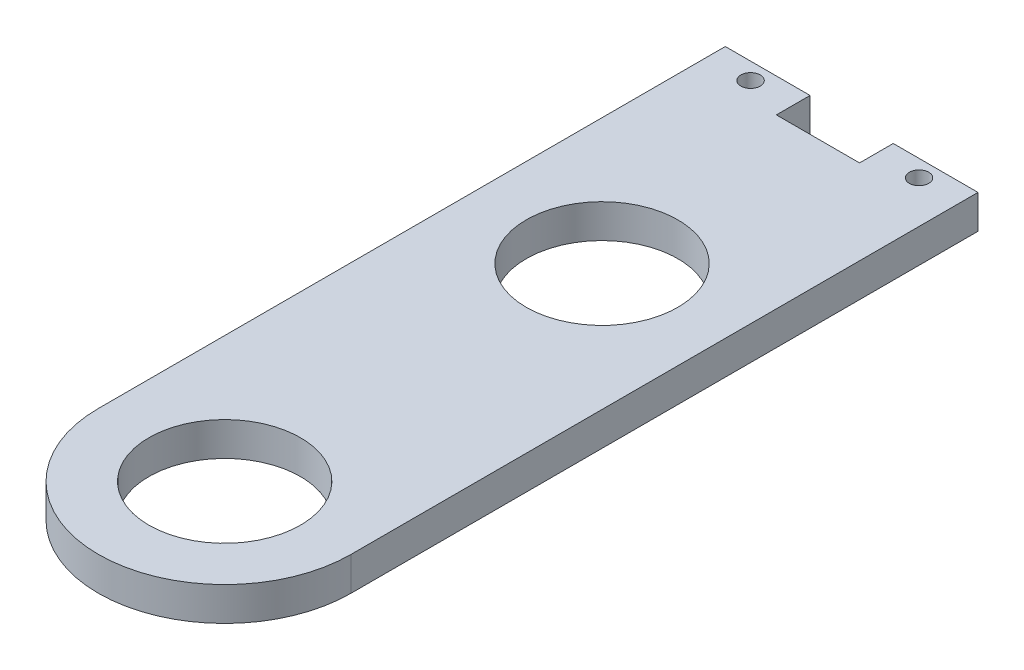
ISO-10303-21;
HEADER;
FILE_DESCRIPTION(('STEP AP214'),'2;1');
FILE_NAME('part.step','',(''),(''),'','','');
FILE_SCHEMA(('AUTOMOTIVE_DESIGN { 1 0 10303 214 1 1 1 1 }'));
ENDSEC;
DATA;
#1=APPLICATION_CONTEXT('core data for automotive mechanical design processes');
#2=APPLICATION_PROTOCOL_DEFINITION('international standard','automotive_design',2000,#1);
#3=PRODUCT_CONTEXT('',#1,'mechanical');
#4=PRODUCT('Part','Part','',(#3));
#5=PRODUCT_RELATED_PRODUCT_CATEGORY('part','',(#4));
#6=PRODUCT_DEFINITION_FORMATION('','',#4);
#7=PRODUCT_DEFINITION_CONTEXT('part definition',#1,'design');
#8=PRODUCT_DEFINITION('design','',#6,#7);
#9=PRODUCT_DEFINITION_SHAPE('','',#8);
#10=(LENGTH_UNIT() NAMED_UNIT(*) SI_UNIT(.MILLI.,.METRE.));
#11=(NAMED_UNIT(*) PLANE_ANGLE_UNIT() SI_UNIT($,.RADIAN.));
#12=(NAMED_UNIT(*) SI_UNIT($,.STERADIAN.) SOLID_ANGLE_UNIT());
#13=UNCERTAINTY_MEASURE_WITH_UNIT(LENGTH_MEASURE(1.E-05),#10,'distance_accuracy_value','');
#14=(GEOMETRIC_REPRESENTATION_CONTEXT(3) GLOBAL_UNCERTAINTY_ASSIGNED_CONTEXT((#13)) GLOBAL_UNIT_ASSIGNED_CONTEXT((#10,
#11,#12)) REPRESENTATION_CONTEXT('',''));
#15=CARTESIAN_POINT('',(0.,0.,0.));
#16=DIRECTION('',(0.,0.,1.));
#17=DIRECTION('',(1.,0.,0.));
#18=AXIS2_PLACEMENT_3D('',#15,#16,#17);
#19=CARTESIAN_POINT('',(0.,6.35,-76.2));
#20=DIRECTION('',(0.,0.,-1.));
#21=DIRECTION('',(-1.,0.,0.));
#22=AXIS2_PLACEMENT_3D('',#19,#20,#21);
#23=PLANE('',#22);
#24=DIRECTION('',(1.,0.,0.));
#25=VECTOR('',#24,1.);
#26=CARTESIAN_POINT('',(0.,6.35,-76.2));
#27=LINE('',#26,#25);
#28=CARTESIAN_POINT('',(-7.83750000000001,6.35,-76.2));
#29=VERTEX_POINT('',#28);
#30=CARTESIAN_POINT('',(7.83749999999999,6.35,-76.2));
#31=VERTEX_POINT('',#30);
#32=EDGE_CURVE('E173',#29,#31,#27,.T.);
#33=ORIENTED_EDGE('',*,*,#32,.T.);
#34=DIRECTION('',(0.,1.,0.));
#35=VECTOR('',#34,1.);
#36=CARTESIAN_POINT('',(7.83749999999999,0.,-76.2));
#37=LINE('',#36,#35);
#38=CARTESIAN_POINT('',(7.83749999999999,0.,-76.2));
#39=VERTEX_POINT('',#38);
#40=EDGE_CURVE('E131',#39,#31,#37,.T.);
#41=ORIENTED_EDGE('',*,*,#40,.F.);
#42=DIRECTION('',(1.,0.,0.));
#43=VECTOR('',#42,1.);
#44=CARTESIAN_POINT('',(0.,0.,-76.2));
#45=LINE('',#44,#43);
#46=CARTESIAN_POINT('',(-7.83750000000001,0.,-76.2));
#47=VERTEX_POINT('',#46);
#48=EDGE_CURVE('E113',#47,#39,#45,.T.);
#49=ORIENTED_EDGE('',*,*,#48,.F.);
#50=DIRECTION('',(0.,1.,0.));
#51=VECTOR('',#50,1.);
#52=CARTESIAN_POINT('',(-7.83750000000001,0.,-76.2));
#53=LINE('',#52,#51);
#54=EDGE_CURVE('E147',#47,#29,#53,.T.);
#55=ORIENTED_EDGE('',*,*,#54,.T.);
#56=EDGE_LOOP('',(#33,#41,#49,#55));
#57=FACE_BOUND('',#56,.T.);
#58=ADVANCED_FACE('F36',(#57),#23,.T.);
#59=CARTESIAN_POINT('',(23.8125,6.35,0.));
#60=DIRECTION('',(-1.,0.,0.));
#61=DIRECTION('',(0.,0.,1.));
#62=AXIS2_PLACEMENT_3D('',#59,#60,#61);
#63=PLANE('',#62);
#64=DIRECTION('',(0.,1.,0.));
#65=VECTOR('',#64,1.);
#66=CARTESIAN_POINT('',(23.8125,0.,35.6108));
#67=LINE('',#66,#65);
#68=CARTESIAN_POINT('',(23.8125,0.,35.6108));
#69=VERTEX_POINT('',#68);
#70=CARTESIAN_POINT('',(23.8125,6.35,35.6108));
#71=VERTEX_POINT('',#70);
#72=EDGE_CURVE('E111',#69,#71,#67,.T.);
#73=ORIENTED_EDGE('',*,*,#72,.F.);
#74=DIRECTION('',(0.,0.,-1.));
#75=VECTOR('',#74,1.);
#76=CARTESIAN_POINT('',(23.8125,0.,0.));
#77=LINE('',#76,#75);
#78=CARTESIAN_POINT('',(23.8125,0.,-82.55));
#79=VERTEX_POINT('',#78);
#80=EDGE_CURVE('E106',#69,#79,#77,.T.);
#81=ORIENTED_EDGE('',*,*,#80,.T.);
#82=DIRECTION('',(0.,1.,0.));
#83=VECTOR('',#82,1.);
#84=CARTESIAN_POINT('',(23.8125,0.,-82.55));
#85=LINE('',#84,#83);
#86=CARTESIAN_POINT('',(23.8125,6.35,-82.55));
#87=VERTEX_POINT('',#86);
#88=EDGE_CURVE('E110',#79,#87,#85,.T.);
#89=ORIENTED_EDGE('',*,*,#88,.T.);
#90=DIRECTION('',(0.,0.,-1.));
#91=VECTOR('',#90,1.);
#92=CARTESIAN_POINT('',(23.8125,6.35,0.));
#93=LINE('',#92,#91);
#94=EDGE_CURVE('E178',#71,#87,#93,.T.);
#95=ORIENTED_EDGE('',*,*,#94,.F.);
#96=EDGE_LOOP('',(#73,#81,#89,#95));
#97=FACE_BOUND('',#96,.T.);
#98=ADVANCED_FACE('F38',(#97),#63,.F.);
#99=CARTESIAN_POINT('',(-23.8125,6.35,0.));
#100=DIRECTION('',(-1.,0.,0.));
#101=DIRECTION('',(0.,0.,1.));
#102=AXIS2_PLACEMENT_3D('',#99,#100,#101);
#103=PLANE('',#102);
#104=DIRECTION('',(0.,0.,-1.));
#105=VECTOR('',#104,1.);
#106=CARTESIAN_POINT('',(-23.8125,0.,0.));
#107=LINE('',#106,#105);
#108=CARTESIAN_POINT('',(-23.8125,0.,35.6108));
#109=VERTEX_POINT('',#108);
#110=CARTESIAN_POINT('',(-23.8125,0.,-82.55));
#111=VERTEX_POINT('',#110);
#112=EDGE_CURVE('E189',#109,#111,#107,.T.);
#113=ORIENTED_EDGE('',*,*,#112,.F.);
#114=DIRECTION('',(0.,1.,0.));
#115=VECTOR('',#114,1.);
#116=CARTESIAN_POINT('',(-23.8125,0.,35.6108));
#117=LINE('',#116,#115);
#118=CARTESIAN_POINT('',(-23.8125,6.35,35.6108));
#119=VERTEX_POINT('',#118);
#120=EDGE_CURVE('E61',#109,#119,#117,.T.);
#121=ORIENTED_EDGE('',*,*,#120,.T.);
#122=DIRECTION('',(0.,0.,-1.));
#123=VECTOR('',#122,1.);
#124=CARTESIAN_POINT('',(-23.8125,6.35,0.));
#125=LINE('',#124,#123);
#126=CARTESIAN_POINT('',(-23.8125,6.35,-82.55));
#127=VERTEX_POINT('',#126);
#128=EDGE_CURVE('E177',#119,#127,#125,.T.);
#129=ORIENTED_EDGE('',*,*,#128,.T.);
#130=DIRECTION('',(0.,1.,0.));
#131=VECTOR('',#130,1.);
#132=CARTESIAN_POINT('',(-23.8125,0.,-82.55));
#133=LINE('',#132,#131);
#134=EDGE_CURVE('E144',#111,#127,#133,.T.);
#135=ORIENTED_EDGE('',*,*,#134,.F.);
#136=EDGE_LOOP('',(#113,#121,#129,#135));
#137=FACE_BOUND('',#136,.T.);
#138=ADVANCED_FACE('F208',(#137),#103,.T.);
#139=CARTESIAN_POINT('',(0.,6.35,0.));
#140=DIRECTION('',(0.,1.,0.));
#141=DIRECTION('',(0.,0.,1.));
#142=AXIS2_PLACEMENT_3D('',#139,#140,#141);
#143=PLANE('',#142);
#144=CARTESIAN_POINT('',(15.875,6.35,-79.375));
#145=DIRECTION('',(0.,1.,0.));
#146=DIRECTION('',(0.,0.,1.));
#147=AXIS2_PLACEMENT_3D('',#144,#145,#146);
#148=CIRCLE('',#147,1.82879999999999);
#149=CARTESIAN_POINT('',(15.875,6.35,-77.5462));
#150=VERTEX_POINT('',#149);
#151=EDGE_CURVE('E166',#150,#150,#148,.T.);
#152=ORIENTED_EDGE('',*,*,#151,.F.);
#153=EDGE_LOOP('',(#152));
#154=FACE_BOUND('',#153,.T.);
#155=CARTESIAN_POINT('',(-15.875,6.35,-79.375));
#156=DIRECTION('',(0.,1.,0.));
#157=DIRECTION('',(0.,0.,1.));
#158=AXIS2_PLACEMENT_3D('',#155,#156,#157);
#159=CIRCLE('',#158,1.82879999999999);
#160=CARTESIAN_POINT('',(-15.875,6.35,-77.5462));
#161=VERTEX_POINT('',#160);
#162=EDGE_CURVE('E157',#161,#161,#159,.T.);
#163=ORIENTED_EDGE('',*,*,#162,.F.);
#164=EDGE_LOOP('',(#163));
#165=FACE_BOUND('',#164,.T.);
#166=CARTESIAN_POINT('',(0.,6.35,35.6108));
#167=DIRECTION('',(0.,1.,0.));
#168=DIRECTION('',(0.,0.,1.));
#169=AXIS2_PLACEMENT_3D('',#166,#167,#168);
#170=CIRCLE('',#169,14.2875);
#171=CARTESIAN_POINT('',(0.,6.35,49.8983));
#172=VERTEX_POINT('',#171);
#173=EDGE_CURVE('E45',#172,#172,#170,.T.);
#174=ORIENTED_EDGE('',*,*,#173,.F.);
#175=EDGE_LOOP('',(#174));
#176=FACE_BOUND('',#175,.T.);
#177=CARTESIAN_POINT('',(0.,6.35,-35.5092));
#178=DIRECTION('',(0.,1.,0.));
#179=DIRECTION('',(0.,0.,1.));
#180=AXIS2_PLACEMENT_3D('',#177,#178,#179);
#181=CIRCLE('',#180,14.2875);
#182=CARTESIAN_POINT('',(0.,6.35,-21.2217));
#183=VERTEX_POINT('',#182);
#184=EDGE_CURVE('E11',#183,#183,#181,.T.);
#185=ORIENTED_EDGE('',*,*,#184,.F.);
#186=EDGE_LOOP('',(#185));
#187=FACE_BOUND('',#186,.T.);
#188=ORIENTED_EDGE('',*,*,#128,.F.);
#189=CARTESIAN_POINT('',(0.,6.35,35.6108));
#190=DIRECTION('',(0.,1.,0.));
#191=DIRECTION('',(0.,0.,1.));
#192=AXIS2_PLACEMENT_3D('',#189,#190,#191);
#193=CIRCLE('',#192,23.8125);
#194=EDGE_CURVE('E150',#119,#71,#193,.T.);
#195=ORIENTED_EDGE('',*,*,#194,.T.);
#196=ORIENTED_EDGE('',*,*,#94,.T.);
#197=DIRECTION('',(1.,0.,0.));
#198=VECTOR('',#197,1.);
#199=CARTESIAN_POINT('',(0.,6.35,-82.55));
#200=LINE('',#199,#198);
#201=CARTESIAN_POINT('',(7.83749999999999,6.35,-82.55));
#202=VERTEX_POINT('',#201);
#203=EDGE_CURVE('E128',#202,#87,#200,.T.);
#204=ORIENTED_EDGE('',*,*,#203,.F.);
#205=DIRECTION('',(0.,0.,-1.));
#206=VECTOR('',#205,1.);
#207=CARTESIAN_POINT('',(7.83749999999999,6.35,0.));
#208=LINE('',#207,#206);
#209=EDGE_CURVE('E123',#31,#202,#208,.T.);
#210=ORIENTED_EDGE('',*,*,#209,.F.);
#211=ORIENTED_EDGE('',*,*,#32,.F.);
#212=DIRECTION('',(0.,0.,1.));
#213=VECTOR('',#212,1.);
#214=CARTESIAN_POINT('',(-7.83750000000001,6.35,0.));
#215=LINE('',#214,#213);
#216=CARTESIAN_POINT('',(-7.83750000000001,6.35,-82.55));
#217=VERTEX_POINT('',#216);
#218=EDGE_CURVE('E53',#217,#29,#215,.T.);
#219=ORIENTED_EDGE('',*,*,#218,.F.);
#220=DIRECTION('',(1.,0.,0.));
#221=VECTOR('',#220,1.);
#222=CARTESIAN_POINT('',(0.,6.35,-82.55));
#223=LINE('',#222,#221);
#224=EDGE_CURVE('E140',#127,#217,#223,.T.);
#225=ORIENTED_EDGE('',*,*,#224,.F.);
#226=EDGE_LOOP('',(#188,#195,#196,#204,#210,#211,#219,#225));
#227=FACE_BOUND('',#226,.T.);
#228=ADVANCED_FACE('F200',(#154,#165,#176,#187,#227),#143,.T.);
#229=CARTESIAN_POINT('',(0.,0.,0.));
#230=DIRECTION('',(0.,1.,0.));
#231=DIRECTION('',(0.,0.,1.));
#232=AXIS2_PLACEMENT_3D('',#229,#230,#231);
#233=PLANE('',#232);
#234=CARTESIAN_POINT('',(15.875,0.,-79.375));
#235=DIRECTION('',(0.,1.,0.));
#236=DIRECTION('',(0.,0.,1.));
#237=AXIS2_PLACEMENT_3D('',#234,#235,#236);
#238=CIRCLE('',#237,1.82879999999999);
#239=CARTESIAN_POINT('',(15.875,0.,-77.5462));
#240=VERTEX_POINT('',#239);
#241=EDGE_CURVE('E40',#240,#240,#238,.T.);
#242=ORIENTED_EDGE('',*,*,#241,.T.);
#243=EDGE_LOOP('',(#242));
#244=FACE_BOUND('',#243,.T.);
#245=CARTESIAN_POINT('',(-15.875,0.,-79.375));
#246=DIRECTION('',(0.,1.,0.));
#247=DIRECTION('',(0.,0.,1.));
#248=AXIS2_PLACEMENT_3D('',#245,#246,#247);
#249=CIRCLE('',#248,1.82879999999999);
#250=CARTESIAN_POINT('',(-15.875,0.,-77.5462));
#251=VERTEX_POINT('',#250);
#252=EDGE_CURVE('E155',#251,#251,#249,.T.);
#253=ORIENTED_EDGE('',*,*,#252,.T.);
#254=EDGE_LOOP('',(#253));
#255=FACE_BOUND('',#254,.T.);
#256=CARTESIAN_POINT('',(0.,0.,-35.5092));
#257=DIRECTION('',(0.,1.,0.));
#258=DIRECTION('',(0.,0.,1.));
#259=AXIS2_PLACEMENT_3D('',#256,#257,#258);
#260=CIRCLE('',#259,14.2875);
#261=CARTESIAN_POINT('',(0.,0.,-21.2217));
#262=VERTEX_POINT('',#261);
#263=EDGE_CURVE('E193',#262,#262,#260,.T.);
#264=ORIENTED_EDGE('',*,*,#263,.T.);
#265=EDGE_LOOP('',(#264));
#266=FACE_BOUND('',#265,.T.);
#267=CARTESIAN_POINT('',(0.,0.,35.6108));
#268=DIRECTION('',(0.,1.,0.));
#269=DIRECTION('',(0.,0.,1.));
#270=AXIS2_PLACEMENT_3D('',#267,#268,#269);
#271=CIRCLE('',#270,14.2875);
#272=CARTESIAN_POINT('',(0.,0.,49.8983));
#273=VERTEX_POINT('',#272);
#274=EDGE_CURVE('E191',#273,#273,#271,.T.);
#275=ORIENTED_EDGE('',*,*,#274,.T.);
#276=EDGE_LOOP('',(#275));
#277=FACE_BOUND('',#276,.T.);
#278=CARTESIAN_POINT('',(0.,0.,35.6108));
#279=DIRECTION('',(0.,1.,0.));
#280=DIRECTION('',(0.,0.,1.));
#281=AXIS2_PLACEMENT_3D('',#278,#279,#280);
#282=CIRCLE('',#281,23.8125);
#283=EDGE_CURVE('E202',#109,#69,#282,.T.);
#284=ORIENTED_EDGE('',*,*,#283,.F.);
#285=ORIENTED_EDGE('',*,*,#112,.T.);
#286=DIRECTION('',(1.,0.,0.));
#287=VECTOR('',#286,1.);
#288=CARTESIAN_POINT('',(0.,0.,-82.55));
#289=LINE('',#288,#287);
#290=CARTESIAN_POINT('',(-7.83750000000001,0.,-82.55));
#291=VERTEX_POINT('',#290);
#292=EDGE_CURVE('E136',#111,#291,#289,.T.);
#293=ORIENTED_EDGE('',*,*,#292,.T.);
#294=DIRECTION('',(0.,0.,1.));
#295=VECTOR('',#294,1.);
#296=CARTESIAN_POINT('',(-7.83750000000001,0.,0.));
#297=LINE('',#296,#295);
#298=EDGE_CURVE('E139',#291,#47,#297,.T.);
#299=ORIENTED_EDGE('',*,*,#298,.T.);
#300=ORIENTED_EDGE('',*,*,#48,.T.);
#301=DIRECTION('',(0.,0.,-1.));
#302=VECTOR('',#301,1.);
#303=CARTESIAN_POINT('',(7.83749999999999,0.,0.));
#304=LINE('',#303,#302);
#305=CARTESIAN_POINT('',(7.83749999999999,0.,-82.55));
#306=VERTEX_POINT('',#305);
#307=EDGE_CURVE('E119',#39,#306,#304,.T.);
#308=ORIENTED_EDGE('',*,*,#307,.T.);
#309=DIRECTION('',(1.,0.,0.));
#310=VECTOR('',#309,1.);
#311=CARTESIAN_POINT('',(0.,0.,-82.55));
#312=LINE('',#311,#310);
#313=EDGE_CURVE('E116',#306,#79,#312,.T.);
#314=ORIENTED_EDGE('',*,*,#313,.T.);
#315=ORIENTED_EDGE('',*,*,#80,.F.);
#316=EDGE_LOOP('',(#284,#285,#293,#299,#300,#308,#314,#315));
#317=FACE_BOUND('',#316,.T.);
#318=ADVANCED_FACE('F117',(#244,#255,#266,#277,#317),#233,.F.);
#319=CARTESIAN_POINT('',(0.,6.35,35.6108));
#320=DIRECTION('',(0.,-1.,0.));
#321=DIRECTION('',(0.,0.,-1.));
#322=AXIS2_PLACEMENT_3D('',#319,#320,#321);
#323=CYLINDRICAL_SURFACE('',#322,14.2875);
#324=ORIENTED_EDGE('',*,*,#173,.T.);
#325=EDGE_LOOP('',(#324));
#326=FACE_BOUND('',#325,.T.);
#327=ORIENTED_EDGE('',*,*,#274,.F.);
#328=EDGE_LOOP('',(#327));
#329=FACE_BOUND('',#328,.T.);
#330=ADVANCED_FACE('F224',(#326,#329),#323,.F.);
#331=CARTESIAN_POINT('',(0.,6.35,-35.5092));
#332=DIRECTION('',(0.,-1.,0.));
#333=DIRECTION('',(0.,0.,-1.));
#334=AXIS2_PLACEMENT_3D('',#331,#332,#333);
#335=CYLINDRICAL_SURFACE('',#334,14.2875);
#336=ORIENTED_EDGE('',*,*,#184,.T.);
#337=EDGE_LOOP('',(#336));
#338=FACE_BOUND('',#337,.T.);
#339=ORIENTED_EDGE('',*,*,#263,.F.);
#340=EDGE_LOOP('',(#339));
#341=FACE_BOUND('',#340,.T.);
#342=ADVANCED_FACE('F216',(#338,#341),#335,.F.);
#343=CARTESIAN_POINT('',(0.,0.,35.6108));
#344=DIRECTION('',(0.,1.,0.));
#345=DIRECTION('',(0.,0.,1.));
#346=AXIS2_PLACEMENT_3D('',#343,#344,#345);
#347=CYLINDRICAL_SURFACE('',#346,23.8125);
#348=ORIENTED_EDGE('',*,*,#194,.F.);
#349=ORIENTED_EDGE('',*,*,#120,.F.);
#350=ORIENTED_EDGE('',*,*,#283,.T.);
#351=ORIENTED_EDGE('',*,*,#72,.T.);
#352=EDGE_LOOP('',(#348,#349,#350,#351));
#353=FACE_BOUND('',#352,.T.);
#354=ADVANCED_FACE('F213',(#353),#347,.T.);
#355=CARTESIAN_POINT('',(-7.83750000000001,0.,0.));
#356=DIRECTION('',(-1.,0.,0.));
#357=DIRECTION('',(0.,0.,1.));
#358=AXIS2_PLACEMENT_3D('',#355,#356,#357);
#359=PLANE('',#358);
#360=ORIENTED_EDGE('',*,*,#218,.T.);
#361=ORIENTED_EDGE('',*,*,#54,.F.);
#362=ORIENTED_EDGE('',*,*,#298,.F.);
#363=DIRECTION('',(0.,1.,0.));
#364=VECTOR('',#363,1.);
#365=CARTESIAN_POINT('',(-7.83750000000001,0.,-82.55));
#366=LINE('',#365,#364);
#367=EDGE_CURVE('E138',#291,#217,#366,.T.);
#368=ORIENTED_EDGE('',*,*,#367,.T.);
#369=EDGE_LOOP('',(#360,#361,#362,#368));
#370=FACE_BOUND('',#369,.T.);
#371=ADVANCED_FACE('F215',(#370),#359,.F.);
#372=CARTESIAN_POINT('',(0.,0.,-82.55));
#373=DIRECTION('',(0.,0.,1.));
#374=DIRECTION('',(1.,0.,0.));
#375=AXIS2_PLACEMENT_3D('',#372,#373,#374);
#376=PLANE('',#375);
#377=ORIENTED_EDGE('',*,*,#224,.T.);
#378=ORIENTED_EDGE('',*,*,#367,.F.);
#379=ORIENTED_EDGE('',*,*,#292,.F.);
#380=ORIENTED_EDGE('',*,*,#134,.T.);
#381=EDGE_LOOP('',(#377,#378,#379,#380));
#382=FACE_BOUND('',#381,.T.);
#383=ADVANCED_FACE('F222',(#382),#376,.F.);
#384=CARTESIAN_POINT('',(7.83749999999999,0.,0.));
#385=DIRECTION('',(1.,0.,0.));
#386=DIRECTION('',(0.,0.,-1.));
#387=AXIS2_PLACEMENT_3D('',#384,#385,#386);
#388=PLANE('',#387);
#389=ORIENTED_EDGE('',*,*,#209,.T.);
#390=DIRECTION('',(0.,1.,0.));
#391=VECTOR('',#390,1.);
#392=CARTESIAN_POINT('',(7.83749999999999,0.,-82.55));
#393=LINE('',#392,#391);
#394=EDGE_CURVE('E129',#306,#202,#393,.T.);
#395=ORIENTED_EDGE('',*,*,#394,.F.);
#396=ORIENTED_EDGE('',*,*,#307,.F.);
#397=ORIENTED_EDGE('',*,*,#40,.T.);
#398=EDGE_LOOP('',(#389,#395,#396,#397));
#399=FACE_BOUND('',#398,.T.);
#400=ADVANCED_FACE('F268',(#399),#388,.F.);
#401=CARTESIAN_POINT('',(0.,0.,-82.55));
#402=DIRECTION('',(0.,0.,1.));
#403=DIRECTION('',(1.,0.,0.));
#404=AXIS2_PLACEMENT_3D('',#401,#402,#403);
#405=PLANE('',#404);
#406=ORIENTED_EDGE('',*,*,#203,.T.);
#407=ORIENTED_EDGE('',*,*,#88,.F.);
#408=ORIENTED_EDGE('',*,*,#313,.F.);
#409=ORIENTED_EDGE('',*,*,#394,.T.);
#410=EDGE_LOOP('',(#406,#407,#408,#409));
#411=FACE_BOUND('',#410,.T.);
#412=ADVANCED_FACE('F126',(#411),#405,.F.);
#413=CARTESIAN_POINT('',(-15.875,-4.99999999997031E-05,-79.375));
#414=DIRECTION('',(0.,1.,0.));
#415=DIRECTION('',(0.,0.,1.));
#416=AXIS2_PLACEMENT_3D('',#413,#414,#415);
#417=CYLINDRICAL_SURFACE('',#416,1.82879999999999);
#418=ORIENTED_EDGE('',*,*,#162,.T.);
#419=EDGE_LOOP('',(#418));
#420=FACE_BOUND('',#419,.T.);
#421=ORIENTED_EDGE('',*,*,#252,.F.);
#422=EDGE_LOOP('',(#421));
#423=FACE_BOUND('',#422,.T.);
#424=ADVANCED_FACE('F260',(#420,#423),#417,.F.);
#425=CARTESIAN_POINT('',(15.875,-4.99999999997031E-05,-79.375));
#426=DIRECTION('',(0.,1.,0.));
#427=DIRECTION('',(0.,0.,1.));
#428=AXIS2_PLACEMENT_3D('',#425,#426,#427);
#429=CYLINDRICAL_SURFACE('',#428,1.82879999999999);
#430=ORIENTED_EDGE('',*,*,#151,.T.);
#431=EDGE_LOOP('',(#430));
#432=FACE_BOUND('',#431,.T.);
#433=ORIENTED_EDGE('',*,*,#241,.F.);
#434=EDGE_LOOP('',(#433));
#435=FACE_BOUND('',#434,.T.);
#436=ADVANCED_FACE('F257',(#432,#435),#429,.F.);
#437=CLOSED_SHELL('',(#58,#98,#138,#228,#318,#330,#342,#354,#371,#383,#400,#412,#424,#436));
#438=MANIFOLD_SOLID_BREP('B2',#437);
#439=ADVANCED_BREP_SHAPE_REPRESENTATION('',(#18,#438),#14);
#440=SHAPE_DEFINITION_REPRESENTATION(#9,#439);
ENDSEC;
END-ISO-10303-21;
